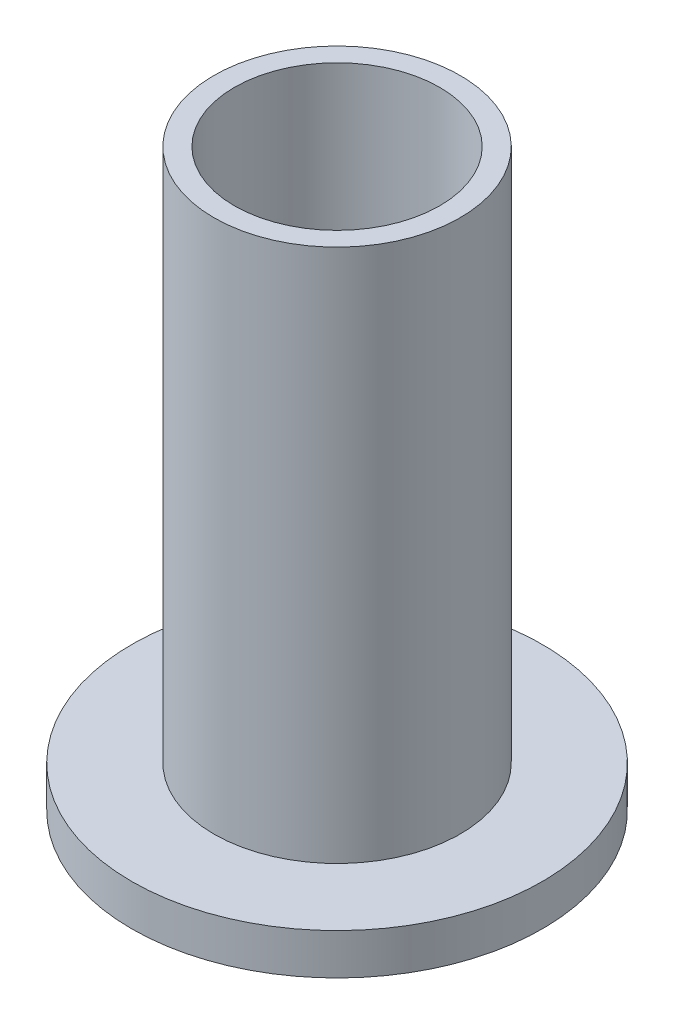
ISO-10303-21;
HEADER;
FILE_DESCRIPTION(('STEP AP214'),'2;1');
FILE_NAME('part.step','',(''),(''),'','','');
FILE_SCHEMA(('AUTOMOTIVE_DESIGN { 1 0 10303 214 1 1 1 1 }'));
ENDSEC;
DATA;
#1=APPLICATION_CONTEXT('core data for automotive mechanical design processes');
#2=APPLICATION_PROTOCOL_DEFINITION('international standard','automotive_design',2000,#1);
#3=PRODUCT_CONTEXT('',#1,'mechanical');
#4=PRODUCT('Part','Part','',(#3));
#5=PRODUCT_RELATED_PRODUCT_CATEGORY('part','',(#4));
#6=PRODUCT_DEFINITION_FORMATION('','',#4);
#7=PRODUCT_DEFINITION_CONTEXT('part definition',#1,'design');
#8=PRODUCT_DEFINITION('design','',#6,#7);
#9=PRODUCT_DEFINITION_SHAPE('','',#8);
#10=(LENGTH_UNIT() NAMED_UNIT(*) SI_UNIT(.MILLI.,.METRE.));
#11=(NAMED_UNIT(*) PLANE_ANGLE_UNIT() SI_UNIT($,.RADIAN.));
#12=(NAMED_UNIT(*) SI_UNIT($,.STERADIAN.) SOLID_ANGLE_UNIT());
#13=UNCERTAINTY_MEASURE_WITH_UNIT(LENGTH_MEASURE(1.E-05),#10,'distance_accuracy_value','');
#14=(GEOMETRIC_REPRESENTATION_CONTEXT(3) GLOBAL_UNCERTAINTY_ASSIGNED_CONTEXT((#13)) GLOBAL_UNIT_ASSIGNED_CONTEXT((#10,
#11,#12)) REPRESENTATION_CONTEXT('',''));
#15=CARTESIAN_POINT('',(0.,0.,0.));
#16=DIRECTION('',(0.,0.,1.));
#17=DIRECTION('',(1.,0.,0.));
#18=AXIS2_PLACEMENT_3D('',#15,#16,#17);
#19=CARTESIAN_POINT('',(-6.,17.1455696202532,0.));
#20=DIRECTION('',(0.,1.,0.));
#21=DIRECTION('',(0.,0.,1.));
#22=AXIS2_PLACEMENT_3D('',#19,#20,#21);
#23=PLANE('',#22);
#24=CARTESIAN_POINT('',(0.,17.1455696202532,0.));
#25=DIRECTION('',(0.,1.,0.));
#26=DIRECTION('',(0.,0.,1.));
#27=AXIS2_PLACEMENT_3D('',#24,#25,#26);
#28=CIRCLE('',#27,6.);
#29=CARTESIAN_POINT('',(0.,17.1455696202532,6.));
#30=VERTEX_POINT('',#29);
#31=EDGE_CURVE('E54',#30,#30,#28,.T.);
#32=ORIENTED_EDGE('',*,*,#31,.T.);
#33=EDGE_LOOP('',(#32));
#34=FACE_BOUND('',#33,.T.);
#35=CARTESIAN_POINT('',(0.,17.1455696202532,0.));
#36=DIRECTION('',(0.,1.,0.));
#37=DIRECTION('',(0.,0.,1.));
#38=AXIS2_PLACEMENT_3D('',#35,#36,#37);
#39=CIRCLE('',#38,5.);
#40=CARTESIAN_POINT('',(0.,17.1455696202532,5.));
#41=VERTEX_POINT('',#40);
#42=EDGE_CURVE('E10',#41,#41,#39,.T.);
#43=ORIENTED_EDGE('',*,*,#42,.F.);
#44=EDGE_LOOP('',(#43));
#45=FACE_BOUND('',#44,.T.);
#46=ADVANCED_FACE('F32',(#34,#45),#23,.T.);
#47=CARTESIAN_POINT('',(0.,15.2848101265823,0.));
#48=DIRECTION('',(0.,1.,0.));
#49=DIRECTION('',(0.,0.,1.));
#50=AXIS2_PLACEMENT_3D('',#47,#48,#49);
#51=CYLINDRICAL_SURFACE('',#50,5.);
#52=ORIENTED_EDGE('',*,*,#42,.T.);
#53=EDGE_LOOP('',(#52));
#54=FACE_BOUND('',#53,.T.);
#55=CARTESIAN_POINT('',(0.,-10.8544303797468,0.));
#56=DIRECTION('',(0.,1.,0.));
#57=DIRECTION('',(0.,0.,1.));
#58=AXIS2_PLACEMENT_3D('',#55,#56,#57);
#59=CIRCLE('',#58,5.);
#60=CARTESIAN_POINT('',(0.,-10.8544303797468,5.));
#61=VERTEX_POINT('',#60);
#62=EDGE_CURVE('E38',#61,#61,#59,.T.);
#63=ORIENTED_EDGE('',*,*,#62,.F.);
#64=EDGE_LOOP('',(#63));
#65=FACE_BOUND('',#64,.T.);
#66=ADVANCED_FACE('F72',(#54,#65),#51,.F.);
#67=CARTESIAN_POINT('',(-5.,-10.8544303797468,0.));
#68=DIRECTION('',(0.,-1.,0.));
#69=DIRECTION('',(0.,0.,-1.));
#70=AXIS2_PLACEMENT_3D('',#67,#68,#69);
#71=PLANE('',#70);
#72=ORIENTED_EDGE('',*,*,#62,.T.);
#73=EDGE_LOOP('',(#72));
#74=FACE_BOUND('',#73,.T.);
#75=CARTESIAN_POINT('',(0.,-10.8544303797468,0.));
#76=DIRECTION('',(0.,1.,0.));
#77=DIRECTION('',(0.,0.,1.));
#78=AXIS2_PLACEMENT_3D('',#75,#76,#77);
#79=CIRCLE('',#78,10.);
#80=CARTESIAN_POINT('',(0.,-10.8544303797468,10.));
#81=VERTEX_POINT('',#80);
#82=EDGE_CURVE('E42',#81,#81,#79,.T.);
#83=ORIENTED_EDGE('',*,*,#82,.F.);
#84=EDGE_LOOP('',(#83));
#85=FACE_BOUND('',#84,.T.);
#86=ADVANCED_FACE('F76',(#74,#85),#71,.T.);
#87=CARTESIAN_POINT('',(0.,15.2848101265823,0.));
#88=DIRECTION('',(0.,1.,0.));
#89=DIRECTION('',(0.,0.,1.));
#90=AXIS2_PLACEMENT_3D('',#87,#88,#89);
#91=CYLINDRICAL_SURFACE('',#90,10.);
#92=ORIENTED_EDGE('',*,*,#82,.T.);
#93=EDGE_LOOP('',(#92));
#94=FACE_BOUND('',#93,.T.);
#95=CARTESIAN_POINT('',(0.,-8.85443037974684,0.));
#96=DIRECTION('',(0.,1.,0.));
#97=DIRECTION('',(0.,0.,1.));
#98=AXIS2_PLACEMENT_3D('',#95,#96,#97);
#99=CIRCLE('',#98,10.);
#100=CARTESIAN_POINT('',(0.,-8.85443037974684,10.));
#101=VERTEX_POINT('',#100);
#102=EDGE_CURVE('E46',#101,#101,#99,.T.);
#103=ORIENTED_EDGE('',*,*,#102,.F.);
#104=EDGE_LOOP('',(#103));
#105=FACE_BOUND('',#104,.T.);
#106=ADVANCED_FACE('F68',(#94,#105),#91,.T.);
#107=CARTESIAN_POINT('',(-10.,-8.85443037974684,0.));
#108=DIRECTION('',(0.,1.,0.));
#109=DIRECTION('',(0.,0.,1.));
#110=AXIS2_PLACEMENT_3D('',#107,#108,#109);
#111=PLANE('',#110);
#112=ORIENTED_EDGE('',*,*,#102,.T.);
#113=EDGE_LOOP('',(#112));
#114=FACE_BOUND('',#113,.T.);
#115=CARTESIAN_POINT('',(0.,-8.85443037974684,0.));
#116=DIRECTION('',(0.,1.,0.));
#117=DIRECTION('',(0.,0.,1.));
#118=AXIS2_PLACEMENT_3D('',#115,#116,#117);
#119=CIRCLE('',#118,6.);
#120=CARTESIAN_POINT('',(0.,-8.85443037974684,6.));
#121=VERTEX_POINT('',#120);
#122=EDGE_CURVE('E51',#121,#121,#119,.T.);
#123=ORIENTED_EDGE('',*,*,#122,.F.);
#124=EDGE_LOOP('',(#123));
#125=FACE_BOUND('',#124,.T.);
#126=ADVANCED_FACE('F62',(#114,#125),#111,.T.);
#127=CARTESIAN_POINT('',(0.,15.2848101265823,0.));
#128=DIRECTION('',(0.,1.,0.));
#129=DIRECTION('',(0.,0.,1.));
#130=AXIS2_PLACEMENT_3D('',#127,#128,#129);
#131=CYLINDRICAL_SURFACE('',#130,6.);
#132=ORIENTED_EDGE('',*,*,#122,.T.);
#133=EDGE_LOOP('',(#132));
#134=FACE_BOUND('',#133,.T.);
#135=ORIENTED_EDGE('',*,*,#31,.F.);
#136=EDGE_LOOP('',(#135));
#137=FACE_BOUND('',#136,.T.);
#138=ADVANCED_FACE('F60',(#134,#137),#131,.T.);
#139=CLOSED_SHELL('',(#46,#66,#86,#106,#126,#138));
#140=MANIFOLD_SOLID_BREP('B2',#139);
#141=ADVANCED_BREP_SHAPE_REPRESENTATION('',(#18,#140),#14);
#142=SHAPE_DEFINITION_REPRESENTATION(#9,#141);
ENDSEC;
END-ISO-10303-21;
